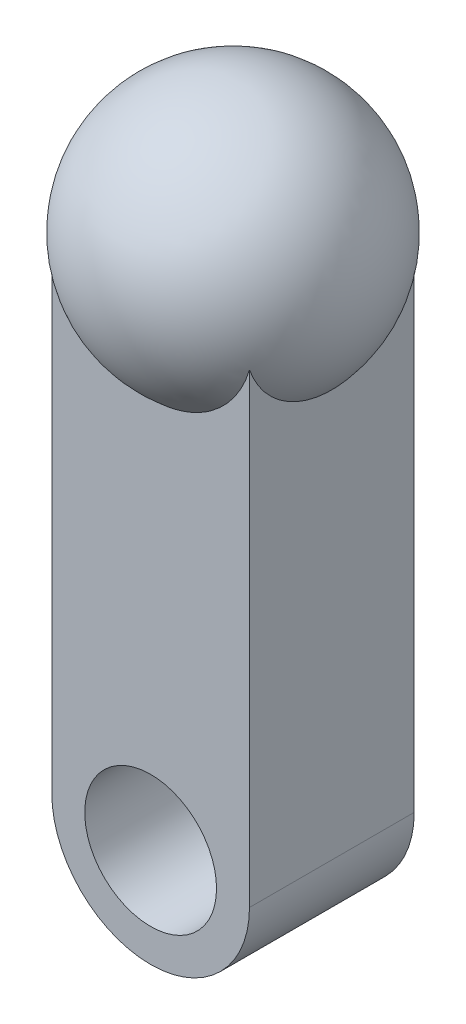
ISO-10303-21;
HEADER;
FILE_DESCRIPTION(('STEP AP214'),'2;1');
FILE_NAME('part.step','',(''),(''),'','','');
FILE_SCHEMA(('AUTOMOTIVE_DESIGN { 1 0 10303 214 1 1 1 1 }'));
ENDSEC;
DATA;
#1=APPLICATION_CONTEXT('core data for automotive mechanical design processes');
#2=APPLICATION_PROTOCOL_DEFINITION('international standard','automotive_design',2000,#1);
#3=PRODUCT_CONTEXT('',#1,'mechanical');
#4=PRODUCT('Part','Part','',(#3));
#5=PRODUCT_RELATED_PRODUCT_CATEGORY('part','',(#4));
#6=PRODUCT_DEFINITION_FORMATION('','',#4);
#7=PRODUCT_DEFINITION_CONTEXT('part definition',#1,'design');
#8=PRODUCT_DEFINITION('design','',#6,#7);
#9=PRODUCT_DEFINITION_SHAPE('','',#8);
#10=(LENGTH_UNIT() NAMED_UNIT(*) SI_UNIT(.MILLI.,.METRE.));
#11=(NAMED_UNIT(*) PLANE_ANGLE_UNIT() SI_UNIT($,.RADIAN.));
#12=(NAMED_UNIT(*) SI_UNIT($,.STERADIAN.) SOLID_ANGLE_UNIT());
#13=UNCERTAINTY_MEASURE_WITH_UNIT(LENGTH_MEASURE(1.E-05),#10,'distance_accuracy_value','');
#14=(GEOMETRIC_REPRESENTATION_CONTEXT(3) GLOBAL_UNCERTAINTY_ASSIGNED_CONTEXT((#13)) GLOBAL_UNIT_ASSIGNED_CONTEXT((#10,
#11,#12)) REPRESENTATION_CONTEXT('',''));
#15=CARTESIAN_POINT('',(0.,0.,0.));
#16=DIRECTION('',(0.,0.,1.));
#17=DIRECTION('',(1.,0.,0.));
#18=AXIS2_PLACEMENT_3D('',#15,#16,#17);
#19=CARTESIAN_POINT('',(3.,15.,-2.5));
#20=DIRECTION('',(1.,0.,0.));
#21=DIRECTION('',(0.,1.,0.));
#22=AXIS2_PLACEMENT_3D('',#19,#20,#21);
#23=PLANE('',#22);
#24=CARTESIAN_POINT('',(3.,15.,0.));
#25=DIRECTION('',(1.,0.,0.));
#26=DIRECTION('',(0.,1.,0.));
#27=AXIS2_PLACEMENT_3D('',#24,#25,#26);
#28=CIRCLE('',#27,2.64575131106459);
#29=CARTESIAN_POINT('',(3.,14.1339745962156,2.5));
#30=VERTEX_POINT('',#29);
#31=CARTESIAN_POINT('',(3.,14.1339745962156,-2.5));
#32=VERTEX_POINT('',#31);
#33=EDGE_CURVE('E85',#30,#32,#28,.T.);
#34=ORIENTED_EDGE('',*,*,#33,.F.);
#35=DIRECTION('',(0.,1.,0.));
#36=VECTOR('',#35,1.);
#37=CARTESIAN_POINT('',(3.,15.,2.5));
#38=LINE('',#37,#36);
#39=CARTESIAN_POINT('',(3.,0.,2.5));
#40=VERTEX_POINT('',#39);
#41=EDGE_CURVE('E75',#40,#30,#38,.T.);
#42=ORIENTED_EDGE('',*,*,#41,.F.);
#43=DIRECTION('',(0.,0.,1.));
#44=VECTOR('',#43,1.);
#45=CARTESIAN_POINT('',(3.,0.,-2.5));
#46=LINE('',#45,#44);
#47=CARTESIAN_POINT('',(3.,0.,-2.5));
#48=VERTEX_POINT('',#47);
#49=EDGE_CURVE('E40',#48,#40,#46,.T.);
#50=ORIENTED_EDGE('',*,*,#49,.F.);
#51=DIRECTION('',(0.,1.,0.));
#52=VECTOR('',#51,1.);
#53=CARTESIAN_POINT('',(3.,15.,-2.5));
#54=LINE('',#53,#52);
#55=EDGE_CURVE('E86',#48,#32,#54,.T.);
#56=ORIENTED_EDGE('',*,*,#55,.T.);
#57=EDGE_LOOP('',(#34,#42,#50,#56));
#58=FACE_BOUND('',#57,.T.);
#59=ADVANCED_FACE('F32',(#58),#23,.T.);
#60=CARTESIAN_POINT('',(0.,0.,-2.5));
#61=DIRECTION('',(0.,0.,1.));
#62=DIRECTION('',(1.,0.,0.));
#63=AXIS2_PLACEMENT_3D('',#60,#61,#62);
#64=CYLINDRICAL_SURFACE('',#63,3.);
#65=ORIENTED_EDGE('',*,*,#49,.T.);
#66=CARTESIAN_POINT('',(0.,0.,2.5));
#67=DIRECTION('',(0.,0.,1.));
#68=DIRECTION('',(1.,0.,0.));
#69=AXIS2_PLACEMENT_3D('',#66,#67,#68);
#70=CIRCLE('',#69,3.);
#71=CARTESIAN_POINT('',(-3.,0.,2.5));
#72=VERTEX_POINT('',#71);
#73=EDGE_CURVE('E80',#72,#40,#70,.T.);
#74=ORIENTED_EDGE('',*,*,#73,.F.);
#75=DIRECTION('',(0.,0.,1.));
#76=VECTOR('',#75,1.);
#77=CARTESIAN_POINT('',(-3.,0.,-2.5));
#78=LINE('',#77,#76);
#79=CARTESIAN_POINT('',(-3.,0.,-2.5));
#80=VERTEX_POINT('',#79);
#81=EDGE_CURVE('E107',#80,#72,#78,.T.);
#82=ORIENTED_EDGE('',*,*,#81,.F.);
#83=CARTESIAN_POINT('',(0.,0.,-2.5));
#84=DIRECTION('',(0.,0.,1.));
#85=DIRECTION('',(1.,0.,0.));
#86=AXIS2_PLACEMENT_3D('',#83,#84,#85);
#87=CIRCLE('',#86,3.);
#88=EDGE_CURVE('E103',#80,#48,#87,.T.);
#89=ORIENTED_EDGE('',*,*,#88,.T.);
#90=EDGE_LOOP('',(#65,#74,#82,#89));
#91=FACE_BOUND('',#90,.T.);
#92=ADVANCED_FACE('F112',(#91),#64,.T.);
#93=CARTESIAN_POINT('',(-3.,15.,-2.5));
#94=DIRECTION('',(-1.,0.,0.));
#95=DIRECTION('',(0.,-1.,0.));
#96=AXIS2_PLACEMENT_3D('',#93,#94,#95);
#97=PLANE('',#96);
#98=CARTESIAN_POINT('',(-3.,15.,0.));
#99=DIRECTION('',(-1.,0.,0.));
#100=DIRECTION('',(0.,-1.,0.));
#101=AXIS2_PLACEMENT_3D('',#98,#99,#100);
#102=CIRCLE('',#101,2.64575131106459);
#103=CARTESIAN_POINT('',(-3.,14.1339745962156,-2.5));
#104=VERTEX_POINT('',#103);
#105=CARTESIAN_POINT('',(-3.,14.1339745962156,2.5));
#106=VERTEX_POINT('',#105);
#107=EDGE_CURVE('E47',#104,#106,#102,.T.);
#108=ORIENTED_EDGE('',*,*,#107,.F.);
#109=DIRECTION('',(0.,-1.,0.));
#110=VECTOR('',#109,1.);
#111=CARTESIAN_POINT('',(-3.,15.,-2.5));
#112=LINE('',#111,#110);
#113=EDGE_CURVE('E101',#104,#80,#112,.T.);
#114=ORIENTED_EDGE('',*,*,#113,.T.);
#115=ORIENTED_EDGE('',*,*,#81,.T.);
#116=DIRECTION('',(0.,-1.,0.));
#117=VECTOR('',#116,1.);
#118=CARTESIAN_POINT('',(-3.,15.,2.5));
#119=LINE('',#118,#117);
#120=EDGE_CURVE('E96',#106,#72,#119,.T.);
#121=ORIENTED_EDGE('',*,*,#120,.F.);
#122=EDGE_LOOP('',(#108,#114,#115,#121));
#123=FACE_BOUND('',#122,.T.);
#124=ADVANCED_FACE('F34',(#123),#97,.T.);
#125=CARTESIAN_POINT('',(0.,15.,-2.5));
#126=DIRECTION('',(0.,0.,1.));
#127=DIRECTION('',(1.,0.,0.));
#128=AXIS2_PLACEMENT_3D('',#125,#126,#127);
#129=PLANE('',#128);
#130=CARTESIAN_POINT('',(0.,0.,-2.5));
#131=DIRECTION('',(0.,0.,1.));
#132=DIRECTION('',(1.,0.,0.));
#133=AXIS2_PLACEMENT_3D('',#130,#131,#132);
#134=CIRCLE('',#133,2.);
#135=CARTESIAN_POINT('',(2.,0.,-2.5));
#136=VERTEX_POINT('',#135);
#137=EDGE_CURVE('E82',#136,#136,#134,.T.);
#138=ORIENTED_EDGE('',*,*,#137,.T.);
#139=EDGE_LOOP('',(#138));
#140=FACE_BOUND('',#139,.T.);
#141=ORIENTED_EDGE('',*,*,#113,.F.);
#142=CARTESIAN_POINT('',(0.,15.,-2.5));
#143=DIRECTION('',(0.,0.,1.));
#144=DIRECTION('',(1.,0.,0.));
#145=AXIS2_PLACEMENT_3D('',#142,#143,#144);
#146=CIRCLE('',#145,3.1224989991992);
#147=EDGE_CURVE('E54',#104,#32,#146,.T.);
#148=ORIENTED_EDGE('',*,*,#147,.T.);
#149=ORIENTED_EDGE('',*,*,#55,.F.);
#150=ORIENTED_EDGE('',*,*,#88,.F.);
#151=EDGE_LOOP('',(#141,#148,#149,#150));
#152=FACE_BOUND('',#151,.T.);
#153=ADVANCED_FACE('F113',(#140,#152),#129,.F.);
#154=CARTESIAN_POINT('',(0.,0.,-2.5));
#155=DIRECTION('',(0.,0.,1.));
#156=DIRECTION('',(1.,0.,0.));
#157=AXIS2_PLACEMENT_3D('',#154,#155,#156);
#158=CYLINDRICAL_SURFACE('',#157,2.);
#159=ORIENTED_EDGE('',*,*,#137,.F.);
#160=EDGE_LOOP('',(#159));
#161=FACE_BOUND('',#160,.T.);
#162=CARTESIAN_POINT('',(0.,0.,2.5));
#163=DIRECTION('',(0.,0.,1.));
#164=DIRECTION('',(1.,0.,0.));
#165=AXIS2_PLACEMENT_3D('',#162,#163,#164);
#166=CIRCLE('',#165,2.);
#167=CARTESIAN_POINT('',(2.,0.,2.5));
#168=VERTEX_POINT('',#167);
#169=EDGE_CURVE('E93',#168,#168,#166,.T.);
#170=ORIENTED_EDGE('',*,*,#169,.T.);
#171=EDGE_LOOP('',(#170));
#172=FACE_BOUND('',#171,.T.);
#173=ADVANCED_FACE('F115',(#161,#172),#158,.F.);
#174=CARTESIAN_POINT('',(0.,15.,2.5));
#175=DIRECTION('',(0.,0.,1.));
#176=DIRECTION('',(1.,0.,0.));
#177=AXIS2_PLACEMENT_3D('',#174,#175,#176);
#178=PLANE('',#177);
#179=CARTESIAN_POINT('',(0.,15.,2.5));
#180=DIRECTION('',(0.,0.,1.));
#181=DIRECTION('',(1.,0.,0.));
#182=AXIS2_PLACEMENT_3D('',#179,#180,#181);
#183=CIRCLE('',#182,3.1224989991992);
#184=EDGE_CURVE('E11',#106,#30,#183,.T.);
#185=ORIENTED_EDGE('',*,*,#184,.F.);
#186=ORIENTED_EDGE('',*,*,#120,.T.);
#187=ORIENTED_EDGE('',*,*,#73,.T.);
#188=ORIENTED_EDGE('',*,*,#41,.T.);
#189=EDGE_LOOP('',(#185,#186,#187,#188));
#190=FACE_BOUND('',#189,.T.);
#191=ORIENTED_EDGE('',*,*,#169,.F.);
#192=EDGE_LOOP('',(#191));
#193=FACE_BOUND('',#192,.T.);
#194=ADVANCED_FACE('F77',(#190,#193),#178,.T.);
#195=CARTESIAN_POINT('',(0.,15.,0.));
#196=DIRECTION('',(0.,-1.,0.));
#197=DIRECTION('',(-1.,0.,0.));
#198=AXIS2_PLACEMENT_3D('',#195,#196,#197);
#199=SPHERICAL_SURFACE('',#198,4.);
#200=ORIENTED_EDGE('',*,*,#147,.F.);
#201=ORIENTED_EDGE('',*,*,#107,.T.);
#202=ORIENTED_EDGE('',*,*,#184,.T.);
#203=ORIENTED_EDGE('',*,*,#33,.T.);
#204=EDGE_LOOP('',(#200,#201,#202,#203));
#205=FACE_BOUND('',#204,.T.);
#206=ADVANCED_FACE('F89',(#205),#199,.T.);
#207=CLOSED_SHELL('',(#59,#92,#124,#153,#173,#194,#206));
#208=MANIFOLD_SOLID_BREP('B2',#207);
#209=ADVANCED_BREP_SHAPE_REPRESENTATION('',(#18,#208),#14);
#210=SHAPE_DEFINITION_REPRESENTATION(#9,#209);
ENDSEC;
END-ISO-10303-21;
